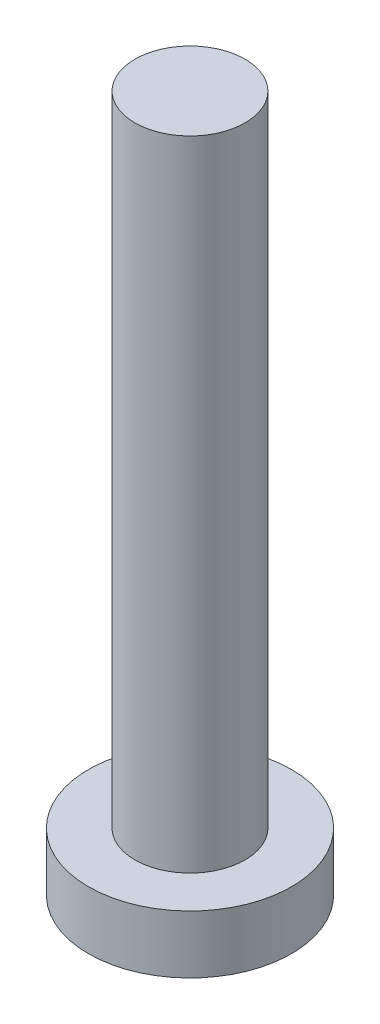
ISO-10303-21;
HEADER;
FILE_DESCRIPTION(('STEP AP214'),'2;1');
FILE_NAME('part.step','',(''),(''),'','','');
FILE_SCHEMA(('AUTOMOTIVE_DESIGN { 1 0 10303 214 1 1 1 1 }'));
ENDSEC;
DATA;
#1=APPLICATION_CONTEXT('core data for automotive mechanical design processes');
#2=APPLICATION_PROTOCOL_DEFINITION('international standard','automotive_design',2000,#1);
#3=PRODUCT_CONTEXT('',#1,'mechanical');
#4=PRODUCT('Part','Part','',(#3));
#5=PRODUCT_RELATED_PRODUCT_CATEGORY('part','',(#4));
#6=PRODUCT_DEFINITION_FORMATION('','',#4);
#7=PRODUCT_DEFINITION_CONTEXT('part definition',#1,'design');
#8=PRODUCT_DEFINITION('design','',#6,#7);
#9=PRODUCT_DEFINITION_SHAPE('','',#8);
#10=(LENGTH_UNIT() NAMED_UNIT(*) SI_UNIT(.MILLI.,.METRE.));
#11=(NAMED_UNIT(*) PLANE_ANGLE_UNIT() SI_UNIT($,.RADIAN.));
#12=(NAMED_UNIT(*) SI_UNIT($,.STERADIAN.) SOLID_ANGLE_UNIT());
#13=UNCERTAINTY_MEASURE_WITH_UNIT(LENGTH_MEASURE(1.E-05),#10,'distance_accuracy_value','');
#14=(GEOMETRIC_REPRESENTATION_CONTEXT(3) GLOBAL_UNCERTAINTY_ASSIGNED_CONTEXT((#13)) GLOBAL_UNIT_ASSIGNED_CONTEXT((#10,
#11,#12)) REPRESENTATION_CONTEXT('',''));
#15=CARTESIAN_POINT('',(0.,0.,0.));
#16=DIRECTION('',(0.,0.,1.));
#17=DIRECTION('',(1.,0.,0.));
#18=AXIS2_PLACEMENT_3D('',#15,#16,#17);
#19=CARTESIAN_POINT('',(0.,-1.,0.));
#20=DIRECTION('',(0.,1.,0.));
#21=DIRECTION('',(0.,0.,1.));
#22=AXIS2_PLACEMENT_3D('',#19,#20,#21);
#23=CYLINDRICAL_SURFACE('',#22,1.75);
#24=CARTESIAN_POINT('',(0.,-1.,0.));
#25=DIRECTION('',(0.,1.,0.));
#26=DIRECTION('',(0.,0.,1.));
#27=AXIS2_PLACEMENT_3D('',#24,#25,#26);
#28=CIRCLE('',#27,1.75);
#29=CARTESIAN_POINT('',(0.,-1.,1.75));
#30=VERTEX_POINT('',#29);
#31=EDGE_CURVE('E38',#30,#30,#28,.T.);
#32=ORIENTED_EDGE('',*,*,#31,.T.);
#33=EDGE_LOOP('',(#32));
#34=FACE_BOUND('',#33,.T.);
#35=CARTESIAN_POINT('',(0.,0.,0.));
#36=DIRECTION('',(0.,1.,0.));
#37=DIRECTION('',(0.,0.,1.));
#38=AXIS2_PLACEMENT_3D('',#35,#36,#37);
#39=CIRCLE('',#38,1.75);
#40=CARTESIAN_POINT('',(0.,0.,1.75));
#41=VERTEX_POINT('',#40);
#42=EDGE_CURVE('E34',#41,#41,#39,.T.);
#43=ORIENTED_EDGE('',*,*,#42,.F.);
#44=EDGE_LOOP('',(#43));
#45=FACE_BOUND('',#44,.T.);
#46=ADVANCED_FACE('F31',(#34,#45),#23,.T.);
#47=CARTESIAN_POINT('',(0.,-1.,0.));
#48=DIRECTION('',(0.,1.,0.));
#49=DIRECTION('',(0.,0.,1.));
#50=AXIS2_PLACEMENT_3D('',#47,#48,#49);
#51=PLANE('',#50);
#52=ORIENTED_EDGE('',*,*,#31,.F.);
#53=EDGE_LOOP('',(#52));
#54=FACE_BOUND('',#53,.T.);
#55=ADVANCED_FACE('F54',(#54),#51,.F.);
#56=CARTESIAN_POINT('',(0.,0.,0.));
#57=DIRECTION('',(0.,1.,0.));
#58=DIRECTION('',(0.,0.,1.));
#59=AXIS2_PLACEMENT_3D('',#56,#57,#58);
#60=PLANE('',#59);
#61=CARTESIAN_POINT('',(0.,0.,0.));
#62=DIRECTION('',(0.,1.,0.));
#63=DIRECTION('',(0.,0.,1.));
#64=AXIS2_PLACEMENT_3D('',#61,#62,#63);
#65=CIRCLE('',#64,0.95);
#66=CARTESIAN_POINT('',(0.,0.,0.95));
#67=VERTEX_POINT('',#66);
#68=EDGE_CURVE('E10',#67,#67,#65,.T.);
#69=ORIENTED_EDGE('',*,*,#68,.F.);
#70=EDGE_LOOP('',(#69));
#71=FACE_BOUND('',#70,.T.);
#72=ORIENTED_EDGE('',*,*,#42,.T.);
#73=EDGE_LOOP('',(#72));
#74=FACE_BOUND('',#73,.T.);
#75=ADVANCED_FACE('F51',(#71,#74),#60,.T.);
#76=CARTESIAN_POINT('',(0.,11.,0.));
#77=DIRECTION('',(0.,-1.,0.));
#78=DIRECTION('',(0.,0.,-1.));
#79=AXIS2_PLACEMENT_3D('',#76,#77,#78);
#80=CYLINDRICAL_SURFACE('',#79,0.95);
#81=CARTESIAN_POINT('',(0.,11.,0.));
#82=DIRECTION('',(0.,1.,0.));
#83=DIRECTION('',(0.,0.,1.));
#84=AXIS2_PLACEMENT_3D('',#81,#82,#83);
#85=CIRCLE('',#84,0.95);
#86=CARTESIAN_POINT('',(0.,11.,0.95));
#87=VERTEX_POINT('',#86);
#88=EDGE_CURVE('E44',#87,#87,#85,.T.);
#89=ORIENTED_EDGE('',*,*,#88,.F.);
#90=EDGE_LOOP('',(#89));
#91=FACE_BOUND('',#90,.T.);
#92=ORIENTED_EDGE('',*,*,#68,.T.);
#93=EDGE_LOOP('',(#92));
#94=FACE_BOUND('',#93,.T.);
#95=ADVANCED_FACE('F65',(#91,#94),#80,.T.);
#96=CARTESIAN_POINT('',(0.,11.,0.));
#97=DIRECTION('',(0.,1.,0.));
#98=DIRECTION('',(0.,0.,1.));
#99=AXIS2_PLACEMENT_3D('',#96,#97,#98);
#100=PLANE('',#99);
#101=ORIENTED_EDGE('',*,*,#88,.T.);
#102=EDGE_LOOP('',(#101));
#103=FACE_BOUND('',#102,.T.);
#104=ADVANCED_FACE('F70',(#103),#100,.T.);
#105=CLOSED_SHELL('',(#46,#55,#75,#95,#104));
#106=MANIFOLD_SOLID_BREP('B2',#105);
#107=ADVANCED_BREP_SHAPE_REPRESENTATION('',(#18,#106),#14);
#108=SHAPE_DEFINITION_REPRESENTATION(#9,#107);
ENDSEC;
END-ISO-10303-21;
